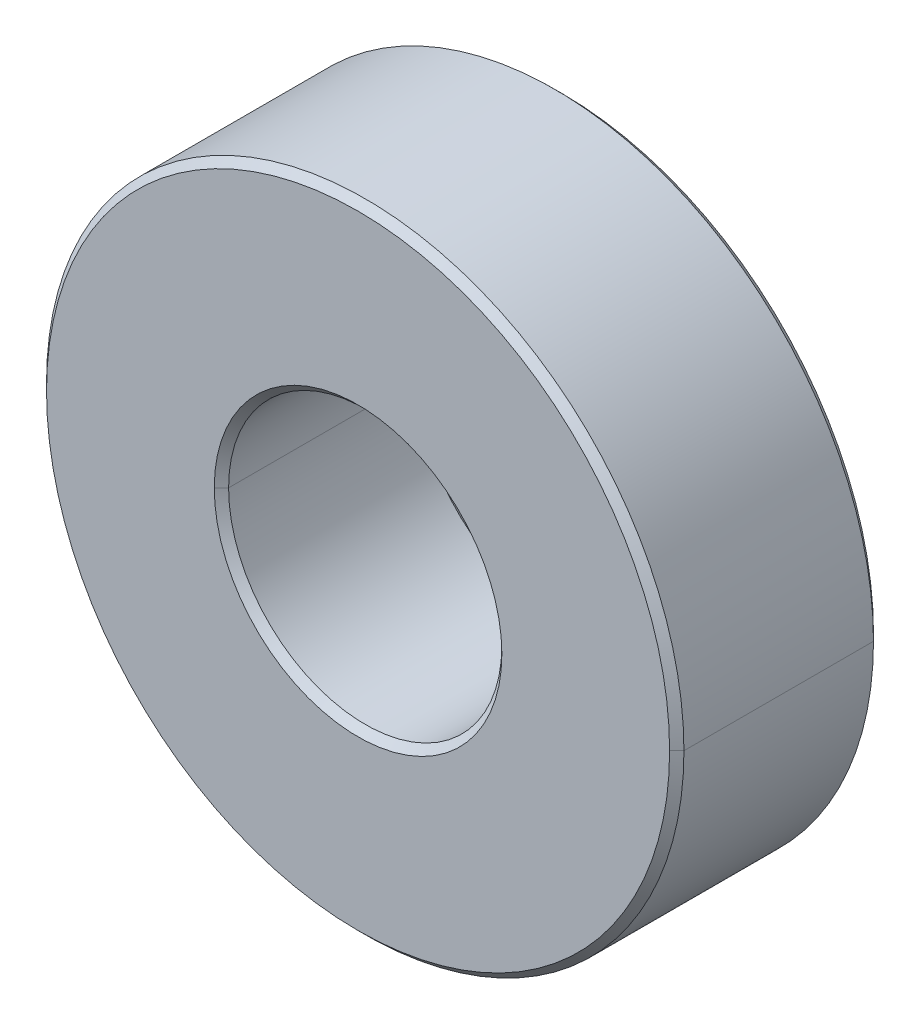
ISO-10303-21;
HEADER;
FILE_DESCRIPTION(('STEP AP214'),'2;1');
FILE_NAME('part.step','',(''),(''),'','','');
FILE_SCHEMA(('AUTOMOTIVE_DESIGN { 1 0 10303 214 1 1 1 1 }'));
ENDSEC;
DATA;
#1=APPLICATION_CONTEXT('core data for automotive mechanical design processes');
#2=APPLICATION_PROTOCOL_DEFINITION('international standard','automotive_design',2000,#1);
#3=PRODUCT_CONTEXT('',#1,'mechanical');
#4=PRODUCT('Part','Part','',(#3));
#5=PRODUCT_RELATED_PRODUCT_CATEGORY('part','',(#4));
#6=PRODUCT_DEFINITION_FORMATION('','',#4);
#7=PRODUCT_DEFINITION_CONTEXT('part definition',#1,'design');
#8=PRODUCT_DEFINITION('design','',#6,#7);
#9=PRODUCT_DEFINITION_SHAPE('','',#8);
#10=(LENGTH_UNIT() NAMED_UNIT(*) SI_UNIT(.MILLI.,.METRE.));
#11=(NAMED_UNIT(*) PLANE_ANGLE_UNIT() SI_UNIT($,.RADIAN.));
#12=(NAMED_UNIT(*) SI_UNIT($,.STERADIAN.) SOLID_ANGLE_UNIT());
#13=UNCERTAINTY_MEASURE_WITH_UNIT(LENGTH_MEASURE(1.E-05),#10,'distance_accuracy_value','');
#14=(GEOMETRIC_REPRESENTATION_CONTEXT(3) GLOBAL_UNCERTAINTY_ASSIGNED_CONTEXT((#13)) GLOBAL_UNIT_ASSIGNED_CONTEXT((#10,
#11,#12)) REPRESENTATION_CONTEXT('',''));
#15=CARTESIAN_POINT('',(0.,0.,0.));
#16=DIRECTION('',(0.,0.,1.));
#17=DIRECTION('',(1.,0.,0.));
#18=AXIS2_PLACEMENT_3D('',#15,#16,#17);
#19=CARTESIAN_POINT('',(0.,0.,7.11));
#20=DIRECTION('',(0.,0.,-1.));
#21=DIRECTION('',(-1.,0.,0.));
#22=AXIS2_PLACEMENT_3D('',#19,#20,#21);
#23=CONICAL_SURFACE('',#22,10.865,0.785398163397442);
#24=CARTESIAN_POINT('',(0.,0.,7.11));
#25=DIRECTION('',(0.,0.,1.));
#26=DIRECTION('',(1.,0.,0.));
#27=AXIS2_PLACEMENT_3D('',#24,#25,#26);
#28=CIRCLE('',#27,10.865);
#29=CARTESIAN_POINT('',(10.865,0.,7.11));
#30=VERTEX_POINT('',#29);
#31=CARTESIAN_POINT('',(-10.865,0.,7.11));
#32=VERTEX_POINT('',#31);
#33=EDGE_CURVE('E41',#30,#32,#28,.T.);
#34=ORIENTED_EDGE('',*,*,#33,.F.);
#35=DIRECTION('',(0.707106781186543,0.,-0.707106781186553));
#36=VECTOR('',#35,1.);
#37=CARTESIAN_POINT('',(10.865,0.,7.11));
#38=LINE('',#37,#36);
#39=CARTESIAN_POINT('',(11.115,0.,6.86));
#40=VERTEX_POINT('',#39);
#41=EDGE_CURVE('E11',#30,#40,#38,.T.);
#42=ORIENTED_EDGE('',*,*,#41,.T.);
#43=CARTESIAN_POINT('',(0.,0.,6.86));
#44=DIRECTION('',(0.,0.,-1.));
#45=DIRECTION('',(1.,0.,0.));
#46=AXIS2_PLACEMENT_3D('',#43,#44,#45);
#47=CIRCLE('',#46,11.115);
#48=CARTESIAN_POINT('',(-11.115,0.,6.86));
#49=VERTEX_POINT('',#48);
#50=EDGE_CURVE('E168',#49,#40,#47,.T.);
#51=ORIENTED_EDGE('',*,*,#50,.F.);
#52=DIRECTION('',(-0.707106781186543,0.,-0.707106781186553));
#53=VECTOR('',#52,1.);
#54=CARTESIAN_POINT('',(-10.865,0.,7.11));
#55=LINE('',#54,#53);
#56=EDGE_CURVE('E154',#32,#49,#55,.T.);
#57=ORIENTED_EDGE('',*,*,#56,.F.);
#58=EDGE_LOOP('',(#34,#42,#51,#57));
#59=FACE_BOUND('',#58,.T.);
#60=ADVANCED_FACE('F16',(#59),#23,.T.);
#61=CARTESIAN_POINT('',(0.,0.,6.86));
#62=DIRECTION('',(0.,0.,1.));
#63=DIRECTION('',(1.,0.,0.));
#64=AXIS2_PLACEMENT_3D('',#61,#62,#63);
#65=CONICAL_SURFACE('',#64,4.765,0.785398163397445);
#66=CARTESIAN_POINT('',(0.,0.,6.86));
#67=DIRECTION('',(0.,0.,1.));
#68=DIRECTION('',(1.,0.,0.));
#69=AXIS2_PLACEMENT_3D('',#66,#67,#68);
#70=CIRCLE('',#69,4.765);
#71=CARTESIAN_POINT('',(-4.765,0.,6.86));
#72=VERTEX_POINT('',#71);
#73=CARTESIAN_POINT('',(4.765,0.,6.86));
#74=VERTEX_POINT('',#73);
#75=EDGE_CURVE('E133',#72,#74,#70,.T.);
#76=ORIENTED_EDGE('',*,*,#75,.F.);
#77=DIRECTION('',(-0.707106781186545,0.,0.70710678118655));
#78=VECTOR('',#77,1.);
#79=CARTESIAN_POINT('',(-4.765,0.,6.86));
#80=LINE('',#79,#78);
#81=CARTESIAN_POINT('',(-5.015,0.,7.11));
#82=VERTEX_POINT('',#81);
#83=EDGE_CURVE('E27',#72,#82,#80,.T.);
#84=ORIENTED_EDGE('',*,*,#83,.T.);
#85=CARTESIAN_POINT('',(0.,0.,7.11));
#86=DIRECTION('',(0.,0.,-1.));
#87=DIRECTION('',(1.,0.,0.));
#88=AXIS2_PLACEMENT_3D('',#85,#86,#87);
#89=CIRCLE('',#88,5.015);
#90=CARTESIAN_POINT('',(5.015,0.,7.11));
#91=VERTEX_POINT('',#90);
#92=EDGE_CURVE('E161',#91,#82,#89,.T.);
#93=ORIENTED_EDGE('',*,*,#92,.F.);
#94=DIRECTION('',(0.707106781186545,0.,0.70710678118655));
#95=VECTOR('',#94,1.);
#96=CARTESIAN_POINT('',(4.765,0.,6.86));
#97=LINE('',#96,#95);
#98=EDGE_CURVE('E151',#74,#91,#97,.T.);
#99=ORIENTED_EDGE('',*,*,#98,.F.);
#100=EDGE_LOOP('',(#76,#84,#93,#99));
#101=FACE_BOUND('',#100,.T.);
#102=ADVANCED_FACE('F290',(#101),#65,.F.);
#103=CARTESIAN_POINT('',(0.,0.,0.));
#104=DIRECTION('',(0.,0.,-1.));
#105=DIRECTION('',(-1.,0.,0.));
#106=AXIS2_PLACEMENT_3D('',#103,#104,#105);
#107=CONICAL_SURFACE('',#106,5.015,0.785398163397445);
#108=CARTESIAN_POINT('',(0.,0.,0.25));
#109=DIRECTION('',(0.,0.,-1.));
#110=DIRECTION('',(1.,0.,0.));
#111=AXIS2_PLACEMENT_3D('',#108,#109,#110);
#112=CIRCLE('',#111,4.765);
#113=CARTESIAN_POINT('',(4.765,0.,0.25));
#114=VERTEX_POINT('',#113);
#115=CARTESIAN_POINT('',(-4.765,0.,0.25));
#116=VERTEX_POINT('',#115);
#117=EDGE_CURVE('E79',#114,#116,#112,.T.);
#118=ORIENTED_EDGE('',*,*,#117,.F.);
#119=DIRECTION('',(0.707106781186545,0.,-0.70710678118655));
#120=VECTOR('',#119,1.);
#121=CARTESIAN_POINT('',(5.015,0.,0.));
#122=LINE('',#121,#120);
#123=CARTESIAN_POINT('',(5.015,0.,0.));
#124=VERTEX_POINT('',#123);
#125=EDGE_CURVE('E132',#114,#124,#122,.T.);
#126=ORIENTED_EDGE('',*,*,#125,.T.);
#127=CARTESIAN_POINT('',(0.,0.,0.));
#128=DIRECTION('',(0.,0.,1.));
#129=DIRECTION('',(1.,0.,0.));
#130=AXIS2_PLACEMENT_3D('',#127,#128,#129);
#131=CIRCLE('',#130,5.015);
#132=CARTESIAN_POINT('',(-5.015,0.,0.));
#133=VERTEX_POINT('',#132);
#134=EDGE_CURVE('E92',#133,#124,#131,.T.);
#135=ORIENTED_EDGE('',*,*,#134,.F.);
#136=DIRECTION('',(-0.707106781186545,0.,-0.70710678118655));
#137=VECTOR('',#136,1.);
#138=CARTESIAN_POINT('',(-5.015,0.,0.));
#139=LINE('',#138,#137);
#140=EDGE_CURVE('E153',#116,#133,#139,.T.);
#141=ORIENTED_EDGE('',*,*,#140,.F.);
#142=EDGE_LOOP('',(#118,#126,#135,#141));
#143=FACE_BOUND('',#142,.T.);
#144=ADVANCED_FACE('F286',(#143),#107,.F.);
#145=CARTESIAN_POINT('',(0.,0.,0.250000000000004));
#146=DIRECTION('',(0.,0.,1.));
#147=DIRECTION('',(1.,0.,0.));
#148=AXIS2_PLACEMENT_3D('',#145,#146,#147);
#149=CONICAL_SURFACE('',#148,11.115,0.785398163397448);
#150=CARTESIAN_POINT('',(0.,0.,0.));
#151=DIRECTION('',(0.,0.,-1.));
#152=DIRECTION('',(1.,0.,0.));
#153=AXIS2_PLACEMENT_3D('',#150,#151,#152);
#154=CIRCLE('',#153,10.865);
#155=CARTESIAN_POINT('',(-10.865,0.,0.));
#156=VERTEX_POINT('',#155);
#157=CARTESIAN_POINT('',(10.865,0.,0.));
#158=VERTEX_POINT('',#157);
#159=EDGE_CURVE('E127',#156,#158,#154,.T.);
#160=ORIENTED_EDGE('',*,*,#159,.F.);
#161=DIRECTION('',(-0.707106781186548,0.,0.707106781186548));
#162=VECTOR('',#161,1.);
#163=CARTESIAN_POINT('',(-11.115,0.,0.250000000000004));
#164=LINE('',#163,#162);
#165=CARTESIAN_POINT('',(-11.115,0.,0.250000000000004));
#166=VERTEX_POINT('',#165);
#167=EDGE_CURVE('E124',#156,#166,#164,.T.);
#168=ORIENTED_EDGE('',*,*,#167,.T.);
#169=CARTESIAN_POINT('',(0.,0.,0.250000000000004));
#170=DIRECTION('',(0.,0.,1.));
#171=DIRECTION('',(1.,0.,0.));
#172=AXIS2_PLACEMENT_3D('',#169,#170,#171);
#173=CIRCLE('',#172,11.115);
#174=CARTESIAN_POINT('',(11.115,0.,0.250000000000004));
#175=VERTEX_POINT('',#174);
#176=EDGE_CURVE('E115',#175,#166,#173,.T.);
#177=ORIENTED_EDGE('',*,*,#176,.F.);
#178=DIRECTION('',(0.707106781186548,0.,0.707106781186548));
#179=VECTOR('',#178,1.);
#180=CARTESIAN_POINT('',(11.115,0.,0.250000000000004));
#181=LINE('',#180,#179);
#182=EDGE_CURVE('E136',#158,#175,#181,.T.);
#183=ORIENTED_EDGE('',*,*,#182,.F.);
#184=EDGE_LOOP('',(#160,#168,#177,#183));
#185=FACE_BOUND('',#184,.T.);
#186=ADVANCED_FACE('F125',(#185),#149,.T.);
#187=CARTESIAN_POINT('',(0.,0.,7.11));
#188=DIRECTION('',(0.,0.,-1.));
#189=DIRECTION('',(-1.,0.,0.));
#190=AXIS2_PLACEMENT_3D('',#187,#188,#189);
#191=CYLINDRICAL_SURFACE('',#190,4.765);
#192=ORIENTED_EDGE('',*,*,#75,.T.);
#193=DIRECTION('',(0.,0.,-1.));
#194=VECTOR('',#193,1.);
#195=CARTESIAN_POINT('',(4.765,0.,7.11));
#196=LINE('',#195,#194);
#197=EDGE_CURVE('E164',#74,#114,#196,.T.);
#198=ORIENTED_EDGE('',*,*,#197,.T.);
#199=ORIENTED_EDGE('',*,*,#117,.T.);
#200=DIRECTION('',(0.,0.,-1.));
#201=VECTOR('',#200,1.);
#202=CARTESIAN_POINT('',(-4.765,0.,7.11));
#203=LINE('',#202,#201);
#204=EDGE_CURVE('E146',#72,#116,#203,.T.);
#205=ORIENTED_EDGE('',*,*,#204,.F.);
#206=EDGE_LOOP('',(#192,#198,#199,#205));
#207=FACE_BOUND('',#206,.T.);
#208=ADVANCED_FACE('F214',(#207),#191,.F.);
#209=CARTESIAN_POINT('',(0.,0.,7.11));
#210=DIRECTION('',(0.,0.,-1.));
#211=DIRECTION('',(-1.,0.,0.));
#212=AXIS2_PLACEMENT_3D('',#209,#210,#211);
#213=CYLINDRICAL_SURFACE('',#212,11.115);
#214=ORIENTED_EDGE('',*,*,#50,.T.);
#215=DIRECTION('',(0.,0.,-1.));
#216=VECTOR('',#215,1.);
#217=CARTESIAN_POINT('',(11.115,0.,7.11));
#218=LINE('',#217,#216);
#219=EDGE_CURVE('E118',#40,#175,#218,.T.);
#220=ORIENTED_EDGE('',*,*,#219,.T.);
#221=ORIENTED_EDGE('',*,*,#176,.T.);
#222=DIRECTION('',(0.,0.,-1.));
#223=VECTOR('',#222,1.);
#224=CARTESIAN_POINT('',(-11.115,0.,7.11));
#225=LINE('',#224,#223);
#226=EDGE_CURVE('E101',#49,#166,#225,.T.);
#227=ORIENTED_EDGE('',*,*,#226,.F.);
#228=EDGE_LOOP('',(#214,#220,#221,#227));
#229=FACE_BOUND('',#228,.T.);
#230=ADVANCED_FACE('F117',(#229),#213,.T.);
#231=CARTESIAN_POINT('',(0.,0.,7.11));
#232=DIRECTION('',(0.,0.,1.));
#233=DIRECTION('',(1.,0.,0.));
#234=AXIS2_PLACEMENT_3D('',#231,#232,#233);
#235=PLANE('',#234);
#236=CARTESIAN_POINT('',(0.,0.,7.11));
#237=DIRECTION('',(0.,0.,1.));
#238=DIRECTION('',(1.,0.,0.));
#239=AXIS2_PLACEMENT_3D('',#236,#237,#238);
#240=CIRCLE('',#239,10.865);
#241=EDGE_CURVE('E20',#32,#30,#240,.T.);
#242=ORIENTED_EDGE('',*,*,#241,.T.);
#243=ORIENTED_EDGE('',*,*,#33,.T.);
#244=EDGE_LOOP('',(#242,#243));
#245=FACE_BOUND('',#244,.T.);
#246=ORIENTED_EDGE('',*,*,#92,.T.);
#247=CARTESIAN_POINT('',(0.,0.,7.11));
#248=DIRECTION('',(0.,0.,-1.));
#249=DIRECTION('',(1.,0.,0.));
#250=AXIS2_PLACEMENT_3D('',#247,#248,#249);
#251=CIRCLE('',#250,5.015);
#252=EDGE_CURVE('E150',#82,#91,#251,.T.);
#253=ORIENTED_EDGE('',*,*,#252,.T.);
#254=EDGE_LOOP('',(#246,#253));
#255=FACE_BOUND('',#254,.T.);
#256=ADVANCED_FACE('F18',(#245,#255),#235,.T.);
#257=CARTESIAN_POINT('',(0.,0.,0.));
#258=DIRECTION('',(0.,0.,1.));
#259=DIRECTION('',(1.,0.,0.));
#260=AXIS2_PLACEMENT_3D('',#257,#258,#259);
#261=PLANE('',#260);
#262=CARTESIAN_POINT('',(0.,0.,0.));
#263=DIRECTION('',(0.,0.,-1.));
#264=DIRECTION('',(1.,0.,0.));
#265=AXIS2_PLACEMENT_3D('',#262,#263,#264);
#266=CIRCLE('',#265,10.865);
#267=EDGE_CURVE('E156',#158,#156,#266,.T.);
#268=ORIENTED_EDGE('',*,*,#267,.T.);
#269=ORIENTED_EDGE('',*,*,#159,.T.);
#270=EDGE_LOOP('',(#268,#269));
#271=FACE_BOUND('',#270,.T.);
#272=ORIENTED_EDGE('',*,*,#134,.T.);
#273=CARTESIAN_POINT('',(0.,0.,0.));
#274=DIRECTION('',(0.,0.,1.));
#275=DIRECTION('',(1.,0.,0.));
#276=AXIS2_PLACEMENT_3D('',#273,#274,#275);
#277=CIRCLE('',#276,5.015);
#278=EDGE_CURVE('E175',#124,#133,#277,.T.);
#279=ORIENTED_EDGE('',*,*,#278,.T.);
#280=EDGE_LOOP('',(#272,#279));
#281=FACE_BOUND('',#280,.T.);
#282=ADVANCED_FACE('F318',(#271,#281),#261,.F.);
#283=CARTESIAN_POINT('',(0.,0.,7.11));
#284=DIRECTION('',(0.,0.,-1.));
#285=DIRECTION('',(-1.,0.,0.));
#286=AXIS2_PLACEMENT_3D('',#283,#284,#285);
#287=CYLINDRICAL_SURFACE('',#286,11.115);
#288=ORIENTED_EDGE('',*,*,#219,.F.);
#289=CARTESIAN_POINT('',(0.,0.,6.86));
#290=DIRECTION('',(0.,0.,-1.));
#291=DIRECTION('',(1.,0.,0.));
#292=AXIS2_PLACEMENT_3D('',#289,#290,#291);
#293=CIRCLE('',#292,11.115);
#294=EDGE_CURVE('E107',#40,#49,#293,.T.);
#295=ORIENTED_EDGE('',*,*,#294,.T.);
#296=ORIENTED_EDGE('',*,*,#226,.T.);
#297=CARTESIAN_POINT('',(0.,0.,0.250000000000004));
#298=DIRECTION('',(0.,0.,1.));
#299=DIRECTION('',(1.,0.,0.));
#300=AXIS2_PLACEMENT_3D('',#297,#298,#299);
#301=CIRCLE('',#300,11.115);
#302=EDGE_CURVE('E105',#166,#175,#301,.T.);
#303=ORIENTED_EDGE('',*,*,#302,.T.);
#304=EDGE_LOOP('',(#288,#295,#296,#303));
#305=FACE_BOUND('',#304,.T.);
#306=ADVANCED_FACE('F103',(#305),#287,.T.);
#307=CARTESIAN_POINT('',(0.,0.,7.11));
#308=DIRECTION('',(0.,0.,-1.));
#309=DIRECTION('',(-1.,0.,0.));
#310=AXIS2_PLACEMENT_3D('',#307,#308,#309);
#311=CYLINDRICAL_SURFACE('',#310,4.765);
#312=ORIENTED_EDGE('',*,*,#197,.F.);
#313=CARTESIAN_POINT('',(0.,0.,6.86));
#314=DIRECTION('',(0.,0.,1.));
#315=DIRECTION('',(1.,0.,0.));
#316=AXIS2_PLACEMENT_3D('',#313,#314,#315);
#317=CIRCLE('',#316,4.765);
#318=EDGE_CURVE('E138',#74,#72,#317,.T.);
#319=ORIENTED_EDGE('',*,*,#318,.T.);
#320=ORIENTED_EDGE('',*,*,#204,.T.);
#321=CARTESIAN_POINT('',(0.,0.,0.25));
#322=DIRECTION('',(0.,0.,-1.));
#323=DIRECTION('',(1.,0.,0.));
#324=AXIS2_PLACEMENT_3D('',#321,#322,#323);
#325=CIRCLE('',#324,4.765);
#326=EDGE_CURVE('E171',#116,#114,#325,.T.);
#327=ORIENTED_EDGE('',*,*,#326,.T.);
#328=EDGE_LOOP('',(#312,#319,#320,#327));
#329=FACE_BOUND('',#328,.T.);
#330=ADVANCED_FACE('F208',(#329),#311,.F.);
#331=CARTESIAN_POINT('',(0.,0.,0.250000000000004));
#332=DIRECTION('',(0.,0.,1.));
#333=DIRECTION('',(1.,0.,0.));
#334=AXIS2_PLACEMENT_3D('',#331,#332,#333);
#335=CONICAL_SURFACE('',#334,11.115,0.785398163397448);
#336=ORIENTED_EDGE('',*,*,#167,.F.);
#337=ORIENTED_EDGE('',*,*,#267,.F.);
#338=ORIENTED_EDGE('',*,*,#182,.T.);
#339=ORIENTED_EDGE('',*,*,#302,.F.);
#340=EDGE_LOOP('',(#336,#337,#338,#339));
#341=FACE_BOUND('',#340,.T.);
#342=ADVANCED_FACE('F135',(#341),#335,.T.);
#343=CARTESIAN_POINT('',(0.,0.,0.));
#344=DIRECTION('',(0.,0.,-1.));
#345=DIRECTION('',(-1.,0.,0.));
#346=AXIS2_PLACEMENT_3D('',#343,#344,#345);
#347=CONICAL_SURFACE('',#346,5.015,0.785398163397445);
#348=ORIENTED_EDGE('',*,*,#125,.F.);
#349=ORIENTED_EDGE('',*,*,#326,.F.);
#350=ORIENTED_EDGE('',*,*,#140,.T.);
#351=ORIENTED_EDGE('',*,*,#278,.F.);
#352=EDGE_LOOP('',(#348,#349,#350,#351));
#353=FACE_BOUND('',#352,.T.);
#354=ADVANCED_FACE('F217',(#353),#347,.F.);
#355=CARTESIAN_POINT('',(0.,0.,6.86));
#356=DIRECTION('',(0.,0.,1.));
#357=DIRECTION('',(1.,0.,0.));
#358=AXIS2_PLACEMENT_3D('',#355,#356,#357);
#359=CONICAL_SURFACE('',#358,4.765,0.785398163397445);
#360=ORIENTED_EDGE('',*,*,#83,.F.);
#361=ORIENTED_EDGE('',*,*,#318,.F.);
#362=ORIENTED_EDGE('',*,*,#98,.T.);
#363=ORIENTED_EDGE('',*,*,#252,.F.);
#364=EDGE_LOOP('',(#360,#361,#362,#363));
#365=FACE_BOUND('',#364,.T.);
#366=ADVANCED_FACE('F251',(#365),#359,.F.);
#367=CARTESIAN_POINT('',(0.,0.,7.11));
#368=DIRECTION('',(0.,0.,-1.));
#369=DIRECTION('',(-1.,0.,0.));
#370=AXIS2_PLACEMENT_3D('',#367,#368,#369);
#371=CONICAL_SURFACE('',#370,10.865,0.785398163397442);
#372=ORIENTED_EDGE('',*,*,#41,.F.);
#373=ORIENTED_EDGE('',*,*,#241,.F.);
#374=ORIENTED_EDGE('',*,*,#56,.T.);
#375=ORIENTED_EDGE('',*,*,#294,.F.);
#376=EDGE_LOOP('',(#372,#373,#374,#375));
#377=FACE_BOUND('',#376,.T.);
#378=ADVANCED_FACE('F269',(#377),#371,.T.);
#379=CLOSED_SHELL('',(#60,#102,#144,#186,#208,#230,#256,#282,#306,#330,#342,#354,#366,#378));
#380=MANIFOLD_SOLID_BREP('B1',#379);
#381=ADVANCED_BREP_SHAPE_REPRESENTATION('',(#18,#380),#14);
#382=SHAPE_DEFINITION_REPRESENTATION(#9,#381);
ENDSEC;
END-ISO-10303-21;
